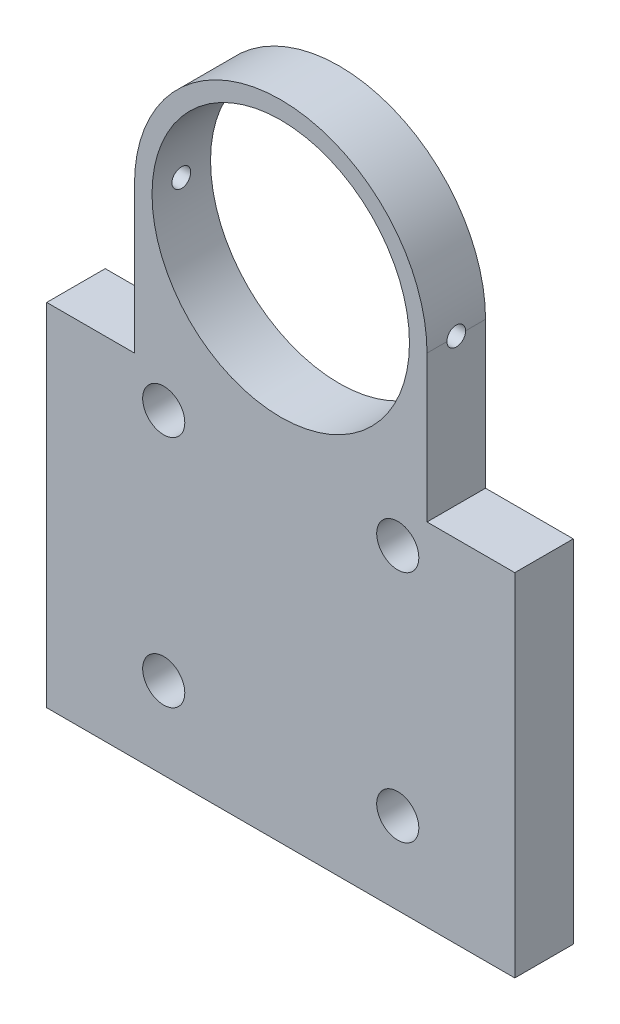
ISO-10303-21;
HEADER;
FILE_DESCRIPTION(('STEP AP214'),'2;1');
FILE_NAME('part.step','',(''),(''),'','','');
FILE_SCHEMA(('AUTOMOTIVE_DESIGN { 1 0 10303 214 1 1 1 1 }'));
ENDSEC;
DATA;
#1=APPLICATION_CONTEXT('core data for automotive mechanical design processes');
#2=APPLICATION_PROTOCOL_DEFINITION('international standard','automotive_design',2000,#1);
#3=PRODUCT_CONTEXT('',#1,'mechanical');
#4=PRODUCT('Part','Part','',(#3));
#5=PRODUCT_RELATED_PRODUCT_CATEGORY('part','',(#4));
#6=PRODUCT_DEFINITION_FORMATION('','',#4);
#7=PRODUCT_DEFINITION_CONTEXT('part definition',#1,'design');
#8=PRODUCT_DEFINITION('design','',#6,#7);
#9=PRODUCT_DEFINITION_SHAPE('','',#8);
#10=(LENGTH_UNIT() NAMED_UNIT(*) SI_UNIT(.MILLI.,.METRE.));
#11=(NAMED_UNIT(*) PLANE_ANGLE_UNIT() SI_UNIT($,.RADIAN.));
#12=(NAMED_UNIT(*) SI_UNIT($,.STERADIAN.) SOLID_ANGLE_UNIT());
#13=UNCERTAINTY_MEASURE_WITH_UNIT(LENGTH_MEASURE(1.E-05),#10,'distance_accuracy_value','');
#14=(GEOMETRIC_REPRESENTATION_CONTEXT(3) GLOBAL_UNCERTAINTY_ASSIGNED_CONTEXT((#13)) GLOBAL_UNIT_ASSIGNED_CONTEXT((#10,
#11,#12)) REPRESENTATION_CONTEXT('',''));
#15=CARTESIAN_POINT('',(0.,0.,0.));
#16=DIRECTION('',(0.,0.,1.));
#17=DIRECTION('',(1.,0.,0.));
#18=AXIS2_PLACEMENT_3D('',#15,#16,#17);
#19=CARTESIAN_POINT('',(-21.,10.5789473684211,5.));
#20=DIRECTION('',(0.,-1.,0.));
#21=DIRECTION('',(0.,0.,-1.));
#22=AXIS2_PLACEMENT_3D('',#19,#20,#21);
#23=PLANE('',#22);
#24=DIRECTION('',(0.,0.,1.));
#25=VECTOR('',#24,1.);
#26=CARTESIAN_POINT('',(-13.5,10.5789473684211,0.));
#27=LINE('',#26,#25);
#28=CARTESIAN_POINT('',(-13.5,10.5789473684211,0.));
#29=VERTEX_POINT('',#28);
#30=CARTESIAN_POINT('',(-13.5,10.5789473684211,5.));
#31=VERTEX_POINT('',#30);
#32=EDGE_CURVE('E139',#29,#31,#27,.T.);
#33=ORIENTED_EDGE('',*,*,#32,.F.);
#34=DIRECTION('',(-1.,0.,0.));
#35=VECTOR('',#34,1.);
#36=CARTESIAN_POINT('',(-21.,10.5789473684211,0.));
#37=LINE('',#36,#35);
#38=CARTESIAN_POINT('',(-21.,10.5789473684211,0.));
#39=VERTEX_POINT('',#38);
#40=EDGE_CURVE('E169',#29,#39,#37,.T.);
#41=ORIENTED_EDGE('',*,*,#40,.T.);
#42=DIRECTION('',(0.,0.,-1.));
#43=VECTOR('',#42,1.);
#44=CARTESIAN_POINT('',(-21.,10.5789473684211,5.));
#45=LINE('',#44,#43);
#46=CARTESIAN_POINT('',(-21.,10.5789473684211,5.));
#47=VERTEX_POINT('',#46);
#48=EDGE_CURVE('E162',#47,#39,#45,.T.);
#49=ORIENTED_EDGE('',*,*,#48,.F.);
#50=DIRECTION('',(-1.,0.,0.));
#51=VECTOR('',#50,1.);
#52=CARTESIAN_POINT('',(-21.,10.5789473684211,5.));
#53=LINE('',#52,#51);
#54=EDGE_CURVE('E158',#31,#47,#53,.T.);
#55=ORIENTED_EDGE('',*,*,#54,.F.);
#56=EDGE_LOOP('',(#33,#41,#49,#55));
#57=FACE_BOUND('',#56,.T.);
#58=ADVANCED_FACE('F39',(#57),#23,.F.);
#59=CARTESIAN_POINT('',(-21.,10.5789473684211,5.));
#60=DIRECTION('',(1.,0.,0.));
#61=DIRECTION('',(0.,0.,-1.));
#62=AXIS2_PLACEMENT_3D('',#59,#60,#61);
#63=PLANE('',#62);
#64=DIRECTION('',(0.,-1.,0.));
#65=VECTOR('',#64,1.);
#66=CARTESIAN_POINT('',(-21.,10.5789473684211,0.));
#67=LINE('',#66,#65);
#68=CARTESIAN_POINT('',(-21.,-19.4210526315789,0.));
#69=VERTEX_POINT('',#68);
#70=EDGE_CURVE('E137',#39,#69,#67,.T.);
#71=ORIENTED_EDGE('',*,*,#70,.T.);
#72=DIRECTION('',(0.,0.,-1.));
#73=VECTOR('',#72,1.);
#74=CARTESIAN_POINT('',(-21.,-19.4210526315789,5.));
#75=LINE('',#74,#73);
#76=CARTESIAN_POINT('',(-21.,-19.4210526315789,5.));
#77=VERTEX_POINT('',#76);
#78=EDGE_CURVE('E123',#77,#69,#75,.T.);
#79=ORIENTED_EDGE('',*,*,#78,.F.);
#80=DIRECTION('',(0.,-1.,0.));
#81=VECTOR('',#80,1.);
#82=CARTESIAN_POINT('',(-21.,10.5789473684211,5.));
#83=LINE('',#82,#81);
#84=EDGE_CURVE('E150',#47,#77,#83,.T.);
#85=ORIENTED_EDGE('',*,*,#84,.F.);
#86=ORIENTED_EDGE('',*,*,#48,.T.);
#87=EDGE_LOOP('',(#71,#79,#85,#86));
#88=FACE_BOUND('',#87,.T.);
#89=ADVANCED_FACE('F41',(#88),#63,.F.);
#90=CARTESIAN_POINT('',(-21.,-19.4210526315789,5.));
#91=DIRECTION('',(0.,1.,0.));
#92=DIRECTION('',(0.,0.,1.));
#93=AXIS2_PLACEMENT_3D('',#90,#91,#92);
#94=PLANE('',#93);
#95=DIRECTION('',(1.,0.,0.));
#96=VECTOR('',#95,1.);
#97=CARTESIAN_POINT('',(-21.,-19.4210526315789,0.));
#98=LINE('',#97,#96);
#99=CARTESIAN_POINT('',(19.,-19.4210526315789,0.));
#100=VERTEX_POINT('',#99);
#101=EDGE_CURVE('E165',#69,#100,#98,.T.);
#102=ORIENTED_EDGE('',*,*,#101,.T.);
#103=DIRECTION('',(0.,0.,-1.));
#104=VECTOR('',#103,1.);
#105=CARTESIAN_POINT('',(19.,-19.4210526315789,5.));
#106=LINE('',#105,#104);
#107=CARTESIAN_POINT('',(19.,-19.4210526315789,5.));
#108=VERTEX_POINT('',#107);
#109=EDGE_CURVE('E177',#108,#100,#106,.T.);
#110=ORIENTED_EDGE('',*,*,#109,.F.);
#111=DIRECTION('',(1.,0.,0.));
#112=VECTOR('',#111,1.);
#113=CARTESIAN_POINT('',(-21.,-19.4210526315789,5.));
#114=LINE('',#113,#112);
#115=EDGE_CURVE('E153',#77,#108,#114,.T.);
#116=ORIENTED_EDGE('',*,*,#115,.F.);
#117=ORIENTED_EDGE('',*,*,#78,.T.);
#118=EDGE_LOOP('',(#102,#110,#116,#117));
#119=FACE_BOUND('',#118,.T.);
#120=ADVANCED_FACE('F233',(#119),#94,.F.);
#121=CARTESIAN_POINT('',(19.,10.5789473684211,5.));
#122=DIRECTION('',(-1.,0.,0.));
#123=DIRECTION('',(0.,0.,1.));
#124=AXIS2_PLACEMENT_3D('',#121,#122,#123);
#125=PLANE('',#124);
#126=DIRECTION('',(0.,1.,0.));
#127=VECTOR('',#126,1.);
#128=CARTESIAN_POINT('',(19.,10.5789473684211,0.));
#129=LINE('',#128,#127);
#130=CARTESIAN_POINT('',(19.,10.5789473684211,0.));
#131=VERTEX_POINT('',#130);
#132=EDGE_CURVE('E167',#100,#131,#129,.T.);
#133=ORIENTED_EDGE('',*,*,#132,.T.);
#134=DIRECTION('',(0.,0.,-1.));
#135=VECTOR('',#134,1.);
#136=CARTESIAN_POINT('',(19.,10.5789473684211,5.));
#137=LINE('',#136,#135);
#138=CARTESIAN_POINT('',(19.,10.5789473684211,5.));
#139=VERTEX_POINT('',#138);
#140=EDGE_CURVE('E174',#139,#131,#137,.T.);
#141=ORIENTED_EDGE('',*,*,#140,.F.);
#142=DIRECTION('',(0.,1.,0.));
#143=VECTOR('',#142,1.);
#144=CARTESIAN_POINT('',(19.,10.5789473684211,5.));
#145=LINE('',#144,#143);
#146=EDGE_CURVE('E156',#108,#139,#145,.T.);
#147=ORIENTED_EDGE('',*,*,#146,.F.);
#148=ORIENTED_EDGE('',*,*,#109,.T.);
#149=EDGE_LOOP('',(#133,#141,#147,#148));
#150=FACE_BOUND('',#149,.T.);
#151=ADVANCED_FACE('F240',(#150),#125,.F.);
#152=CARTESIAN_POINT('',(11.5,10.5789473684211,0.));
#153=VERTEX_POINT('',#152);
#154=EDGE_CURVE('E154',#131,#153,#37,.T.);
#155=ORIENTED_EDGE('',*,*,#154,.T.);
#156=DIRECTION('',(0.,0.,1.));
#157=VECTOR('',#156,1.);
#158=CARTESIAN_POINT('',(11.5,10.5789473684211,0.));
#159=LINE('',#158,#157);
#160=CARTESIAN_POINT('',(11.5,10.5789473684211,5.));
#161=VERTEX_POINT('',#160);
#162=EDGE_CURVE('E135',#153,#161,#159,.T.);
#163=ORIENTED_EDGE('',*,*,#162,.T.);
#164=EDGE_CURVE('E159',#139,#161,#53,.T.);
#165=ORIENTED_EDGE('',*,*,#164,.F.);
#166=ORIENTED_EDGE('',*,*,#140,.T.);
#167=EDGE_LOOP('',(#155,#163,#165,#166));
#168=FACE_BOUND('',#167,.T.);
#169=ADVANCED_FACE('F229',(#168),#23,.F.);
#170=CARTESIAN_POINT('',(0.,0.,5.));
#171=DIRECTION('',(0.,0.,1.));
#172=DIRECTION('',(1.,0.,0.));
#173=AXIS2_PLACEMENT_3D('',#170,#171,#172);
#174=PLANE('',#173);
#175=CARTESIAN_POINT('',(-11.,7.57894736842105,5.));
#176=DIRECTION('',(0.,0.,1.));
#177=DIRECTION('',(1.,0.,0.));
#178=AXIS2_PLACEMENT_3D('',#175,#176,#177);
#179=CIRCLE('',#178,1.79999999999999);
#180=CARTESIAN_POINT('',(-9.20000000000001,7.57894736842105,5.));
#181=VERTEX_POINT('',#180);
#182=EDGE_CURVE('E298',#181,#181,#179,.T.);
#183=ORIENTED_EDGE('',*,*,#182,.F.);
#184=EDGE_LOOP('',(#183));
#185=FACE_BOUND('',#184,.T.);
#186=CARTESIAN_POINT('',(-11.,-12.4210526315789,5.));
#187=DIRECTION('',(0.,0.,1.));
#188=DIRECTION('',(1.,0.,0.));
#189=AXIS2_PLACEMENT_3D('',#186,#187,#188);
#190=CIRCLE('',#189,1.79999999999999);
#191=CARTESIAN_POINT('',(-9.20000000000001,-12.4210526315789,5.));
#192=VERTEX_POINT('',#191);
#193=EDGE_CURVE('E293',#192,#192,#190,.T.);
#194=ORIENTED_EDGE('',*,*,#193,.F.);
#195=EDGE_LOOP('',(#194));
#196=FACE_BOUND('',#195,.T.);
#197=CARTESIAN_POINT('',(9.00000000000001,-12.4210526315789,5.));
#198=DIRECTION('',(0.,0.,1.));
#199=DIRECTION('',(1.,0.,0.));
#200=AXIS2_PLACEMENT_3D('',#197,#198,#199);
#201=CIRCLE('',#200,1.79999999999999);
#202=CARTESIAN_POINT('',(10.8,-12.4210526315789,5.));
#203=VERTEX_POINT('',#202);
#204=EDGE_CURVE('E287',#203,#203,#201,.T.);
#205=ORIENTED_EDGE('',*,*,#204,.F.);
#206=EDGE_LOOP('',(#205));
#207=FACE_BOUND('',#206,.T.);
#208=CARTESIAN_POINT('',(9.00000000000001,7.57894736842105,5.));
#209=DIRECTION('',(0.,0.,1.));
#210=DIRECTION('',(1.,0.,0.));
#211=AXIS2_PLACEMENT_3D('',#208,#209,#210);
#212=CIRCLE('',#211,1.79999999999999);
#213=CARTESIAN_POINT('',(10.8,7.57894736842105,5.));
#214=VERTEX_POINT('',#213);
#215=EDGE_CURVE('E281',#214,#214,#212,.T.);
#216=ORIENTED_EDGE('',*,*,#215,.F.);
#217=EDGE_LOOP('',(#216));
#218=FACE_BOUND('',#217,.T.);
#219=CARTESIAN_POINT('',(-0.999999999999998,23.078947368421,5.));
#220=DIRECTION('',(0.,0.,1.));
#221=DIRECTION('',(1.,0.,0.));
#222=AXIS2_PLACEMENT_3D('',#219,#220,#221);
#223=CIRCLE('',#222,11.);
#224=CARTESIAN_POINT('',(10.,23.078947368421,5.));
#225=VERTEX_POINT('',#224);
#226=EDGE_CURVE('E275',#225,#225,#223,.T.);
#227=ORIENTED_EDGE('',*,*,#226,.F.);
#228=EDGE_LOOP('',(#227));
#229=FACE_BOUND('',#228,.T.);
#230=ORIENTED_EDGE('',*,*,#84,.T.);
#231=ORIENTED_EDGE('',*,*,#115,.T.);
#232=ORIENTED_EDGE('',*,*,#146,.T.);
#233=ORIENTED_EDGE('',*,*,#164,.T.);
#234=DIRECTION('',(0.,-1.,0.));
#235=VECTOR('',#234,1.);
#236=CARTESIAN_POINT('',(11.5,0.,5.));
#237=LINE('',#236,#235);
#238=CARTESIAN_POINT('',(11.5,23.0789473684211,5.));
#239=VERTEX_POINT('',#238);
#240=EDGE_CURVE('E142',#239,#161,#237,.T.);
#241=ORIENTED_EDGE('',*,*,#240,.F.);
#242=CARTESIAN_POINT('',(-0.999999999999997,23.0789473684211,5.));
#243=DIRECTION('',(0.,0.,1.));
#244=DIRECTION('',(1.,0.,0.));
#245=AXIS2_PLACEMENT_3D('',#242,#243,#244);
#246=CIRCLE('',#245,12.5);
#247=CARTESIAN_POINT('',(-13.5,23.0789473684211,5.));
#248=VERTEX_POINT('',#247);
#249=EDGE_CURVE('E134',#239,#248,#246,.T.);
#250=ORIENTED_EDGE('',*,*,#249,.T.);
#251=DIRECTION('',(0.,-1.,0.));
#252=VECTOR('',#251,1.);
#253=CARTESIAN_POINT('',(-13.5,0.,5.));
#254=LINE('',#253,#252);
#255=EDGE_CURVE('E264',#248,#31,#254,.T.);
#256=ORIENTED_EDGE('',*,*,#255,.T.);
#257=ORIENTED_EDGE('',*,*,#54,.T.);
#258=EDGE_LOOP('',(#230,#231,#232,#233,#241,#250,#256,#257));
#259=FACE_BOUND('',#258,.T.);
#260=ADVANCED_FACE('F239',(#185,#196,#207,#218,#229,#259),#174,.T.);
#261=CARTESIAN_POINT('',(0.,0.,0.));
#262=DIRECTION('',(0.,0.,1.));
#263=DIRECTION('',(1.,0.,0.));
#264=AXIS2_PLACEMENT_3D('',#261,#262,#263);
#265=PLANE('',#264);
#266=CARTESIAN_POINT('',(-11.,7.57894736842105,0.));
#267=DIRECTION('',(0.,0.,1.));
#268=DIRECTION('',(1.,0.,0.));
#269=AXIS2_PLACEMENT_3D('',#266,#267,#268);
#270=CIRCLE('',#269,1.8);
#271=CARTESIAN_POINT('',(-9.2,7.57894736842105,0.));
#272=VERTEX_POINT('',#271);
#273=EDGE_CURVE('E296',#272,#272,#270,.T.);
#274=ORIENTED_EDGE('',*,*,#273,.T.);
#275=EDGE_LOOP('',(#274));
#276=FACE_BOUND('',#275,.T.);
#277=CARTESIAN_POINT('',(-11.,-12.4210526315789,0.));
#278=DIRECTION('',(0.,0.,1.));
#279=DIRECTION('',(1.,0.,0.));
#280=AXIS2_PLACEMENT_3D('',#277,#278,#279);
#281=CIRCLE('',#280,1.8);
#282=CARTESIAN_POINT('',(-9.19999999999999,-12.4210526315789,0.));
#283=VERTEX_POINT('',#282);
#284=EDGE_CURVE('E290',#283,#283,#281,.T.);
#285=ORIENTED_EDGE('',*,*,#284,.T.);
#286=EDGE_LOOP('',(#285));
#287=FACE_BOUND('',#286,.T.);
#288=CARTESIAN_POINT('',(9.00000000000001,-12.4210526315789,0.));
#289=DIRECTION('',(0.,0.,1.));
#290=DIRECTION('',(1.,0.,0.));
#291=AXIS2_PLACEMENT_3D('',#288,#289,#290);
#292=CIRCLE('',#291,1.8);
#293=CARTESIAN_POINT('',(10.8,-12.4210526315789,0.));
#294=VERTEX_POINT('',#293);
#295=EDGE_CURVE('E284',#294,#294,#292,.T.);
#296=ORIENTED_EDGE('',*,*,#295,.T.);
#297=EDGE_LOOP('',(#296));
#298=FACE_BOUND('',#297,.T.);
#299=CARTESIAN_POINT('',(9.00000000000001,7.57894736842105,0.));
#300=DIRECTION('',(0.,0.,1.));
#301=DIRECTION('',(1.,0.,0.));
#302=AXIS2_PLACEMENT_3D('',#299,#300,#301);
#303=CIRCLE('',#302,1.8);
#304=CARTESIAN_POINT('',(10.8,7.57894736842105,0.));
#305=VERTEX_POINT('',#304);
#306=EDGE_CURVE('E278',#305,#305,#303,.T.);
#307=ORIENTED_EDGE('',*,*,#306,.T.);
#308=EDGE_LOOP('',(#307));
#309=FACE_BOUND('',#308,.T.);
#310=CARTESIAN_POINT('',(-0.999999999999998,23.078947368421,0.));
#311=DIRECTION('',(0.,0.,1.));
#312=DIRECTION('',(1.,0.,0.));
#313=AXIS2_PLACEMENT_3D('',#310,#311,#312);
#314=CIRCLE('',#313,11.);
#315=CARTESIAN_POINT('',(10.,23.078947368421,0.));
#316=VERTEX_POINT('',#315);
#317=EDGE_CURVE('E269',#316,#316,#314,.T.);
#318=ORIENTED_EDGE('',*,*,#317,.T.);
#319=EDGE_LOOP('',(#318));
#320=FACE_BOUND('',#319,.T.);
#321=ORIENTED_EDGE('',*,*,#70,.F.);
#322=ORIENTED_EDGE('',*,*,#40,.F.);
#323=DIRECTION('',(0.,-1.,0.));
#324=VECTOR('',#323,1.);
#325=CARTESIAN_POINT('',(-13.5,0.,0.));
#326=LINE('',#325,#324);
#327=CARTESIAN_POINT('',(-13.5,23.0789473684211,0.));
#328=VERTEX_POINT('',#327);
#329=EDGE_CURVE('E261',#328,#29,#326,.T.);
#330=ORIENTED_EDGE('',*,*,#329,.F.);
#331=CARTESIAN_POINT('',(-0.999999999999997,23.0789473684211,0.));
#332=DIRECTION('',(0.,0.,1.));
#333=DIRECTION('',(1.,0.,0.));
#334=AXIS2_PLACEMENT_3D('',#331,#332,#333);
#335=CIRCLE('',#334,12.5);
#336=CARTESIAN_POINT('',(11.5,23.0789473684211,0.));
#337=VERTEX_POINT('',#336);
#338=EDGE_CURVE('E260',#337,#328,#335,.T.);
#339=ORIENTED_EDGE('',*,*,#338,.F.);
#340=DIRECTION('',(0.,-1.,0.));
#341=VECTOR('',#340,1.);
#342=CARTESIAN_POINT('',(11.5,0.,0.));
#343=LINE('',#342,#341);
#344=EDGE_CURVE('E257',#337,#153,#343,.T.);
#345=ORIENTED_EDGE('',*,*,#344,.T.);
#346=ORIENTED_EDGE('',*,*,#154,.F.);
#347=ORIENTED_EDGE('',*,*,#132,.F.);
#348=ORIENTED_EDGE('',*,*,#101,.F.);
#349=EDGE_LOOP('',(#321,#322,#330,#339,#345,#346,#347,#348));
#350=FACE_BOUND('',#349,.T.);
#351=ADVANCED_FACE('F246',(#276,#287,#298,#309,#320,#350),#265,.F.);
#352=CARTESIAN_POINT('',(-0.999999999999997,23.0789473684211,0.));
#353=DIRECTION('',(0.,0.,1.));
#354=DIRECTION('',(1.,0.,0.));
#355=AXIS2_PLACEMENT_3D('',#352,#353,#354);
#356=CYLINDRICAL_SURFACE('',#355,12.5);
#357=CARTESIAN_POINT('',(-13.5,23.0789473684211,3.3));
#358=CARTESIAN_POINT('',(-13.500009324827,23.1239043571365,3.30003843768824));
#359=CARTESIAN_POINT('',(-13.4997577278578,23.1688488998711,3.29621270249248));
#360=CARTESIAN_POINT('',(-13.4988016404107,23.2574291850839,3.28111744909941));
#361=CARTESIAN_POINT('',(-13.4980975200611,23.3010659667056,3.2698540141439));
#362=CARTESIAN_POINT('',(-13.496304742774,23.3858425126583,3.24016070909847));
#363=CARTESIAN_POINT('',(-13.4952159211092,23.4269811984598,3.22172776871925));
#364=CARTESIAN_POINT('',(-13.4927792066958,23.5055744344902,3.17823669385076));
#365=CARTESIAN_POINT('',(-13.4914313568159,23.5430295927888,3.15317965538219));
#366=CARTESIAN_POINT('',(-13.4886250932701,23.6132537266337,3.09710840832484));
#367=CARTESIAN_POINT('',(-13.4871665389431,23.6460165823085,3.06608654144862));
#368=CARTESIAN_POINT('',(-13.4843044662695,23.7058780861235,2.99897879147311));
#369=CARTESIAN_POINT('',(-13.4829009563378,23.7329758709448,2.96289213793264));
#370=CARTESIAN_POINT('',(-13.4803062495662,23.7807529262762,2.88664538451462));
#371=CARTESIAN_POINT('',(-13.4791152282162,23.8014269018489,2.84648196026909));
#372=CARTESIAN_POINT('',(-13.4770818030592,23.8357344571371,2.76324770165291));
#373=CARTESIAN_POINT('',(-13.4762393740012,23.8493685468196,2.72017707813449));
#374=CARTESIAN_POINT('',(-13.4749994409246,23.8691932262025,2.63241107532125));
#375=CARTESIAN_POINT('',(-13.474601331411,23.8753939465578,2.58771799305229));
#376=CARTESIAN_POINT('',(-13.4742931193321,23.8802071741541,2.4979225986159));
#377=CARTESIAN_POINT('',(-13.4743830230442,23.878819583784,2.4528202811918));
#378=CARTESIAN_POINT('',(-13.4750401533969,23.8685037185327,2.36355826152029));
#379=CARTESIAN_POINT('',(-13.4756066717579,23.8595866328871,2.31939726020862));
#380=CARTESIAN_POINT('',(-13.4771520712815,23.834482284883,2.23320036401512));
#381=CARTESIAN_POINT('',(-13.478130953138,23.8182950102903,2.19116447270957));
#382=CARTESIAN_POINT('',(-13.4803916068206,23.7790967294459,2.11037408963184));
#383=CARTESIAN_POINT('',(-13.4816736099266,23.7560805093099,2.07162213430687));
#384=CARTESIAN_POINT('',(-13.4843957265884,23.7038825389632,1.99852943053225));
#385=CARTESIAN_POINT('',(-13.4858358345621,23.6747010063927,1.96418852643795));
#386=CARTESIAN_POINT('',(-13.4887148648609,23.6109425311004,1.90083013064313));
#387=CARTESIAN_POINT('',(-13.4901537812141,23.5763566810207,1.87182160265181));
#388=CARTESIAN_POINT('',(-13.4928664408433,23.502787523973,1.82001196403028));
#389=CARTESIAN_POINT('',(-13.4941401324877,23.4638028494823,1.79721279134864));
#390=CARTESIAN_POINT('',(-13.4963790682752,23.3825322094063,1.75847078699582));
#391=CARTESIAN_POINT('',(-13.4973441096396,23.3402440961135,1.74253246043153));
#392=CARTESIAN_POINT('',(-13.498854269046,23.2536169684637,1.71800874615765));
#393=CARTESIAN_POINT('',(-13.4994000256223,23.2092811821448,1.70941217535491));
#394=CARTESIAN_POINT('',(-13.4998042187066,23.1503614976764,1.70306446491594));
#395=CARTESIAN_POINT('',(-13.4998775964454,23.1360903765343,1.70191469729486));
#396=CARTESIAN_POINT('',(-13.4999754235184,23.1075305761044,1.70038350994425));
#397=CARTESIAN_POINT('',(-13.4999999539809,23.0932419654346,1.70000081620679));
#398=CARTESIAN_POINT('',(-13.5,23.0789473684211,1.7));
#399=B_SPLINE_CURVE_WITH_KNOTS('',3,(#357,#358,#359,#360,#361,#362,#363,#364,#365,#366,#367,
#368,#369,#370,#371,#372,#373,#374,#375,#376,#377,#378,#379,#380,#381,#382,#383,#384,#385,#386,
#387,#388,#389,#390,#391,#392,#393,#394,#395,#396,#397,#398),.UNSPECIFIED.,.F.,.F.,(4,2,2,2,2,2,
2,2,2,2,2,2,2,2,2,2,2,2,2,2,4),(0.,0.13468976313037,0.269269500679859,0.403906934605164,
0.53852210540087,0.673311277824672,0.808120976267469,0.943041500985903,1.07795225073311,
1.21267892598129,1.34740733426862,1.48193588052909,1.61646465317549,1.75109640370693,
1.88572340242989,2.02057467955862,2.15546799585623,2.29044975389995,2.42522553673565,
2.46816359043064,2.51103027042707),.UNSPECIFIED.);
#400=CARTESIAN_POINT('',(-13.5,23.0789473684211,3.3));
#401=VERTEX_POINT('',#400);
#402=CARTESIAN_POINT('',(-13.5,23.0789473684211,1.7));
#403=VERTEX_POINT('',#402);
#404=EDGE_CURVE('E11',#401,#403,#399,.T.);
#405=ORIENTED_EDGE('',*,*,#404,.F.);
#406=DIRECTION('',(0.,0.,1.));
#407=VECTOR('',#406,1.);
#408=CARTESIAN_POINT('',(-13.5,23.0789473684211,0.));
#409=LINE('',#408,#407);
#410=EDGE_CURVE('E149',#401,#248,#409,.T.);
#411=ORIENTED_EDGE('',*,*,#410,.T.);
#412=ORIENTED_EDGE('',*,*,#249,.F.);
#413=DIRECTION('',(0.,0.,1.));
#414=VECTOR('',#413,1.);
#415=CARTESIAN_POINT('',(11.5,23.0789473684211,0.));
#416=LINE('',#415,#414);
#417=CARTESIAN_POINT('',(11.5,23.0789473684211,3.3));
#418=VERTEX_POINT('',#417);
#419=EDGE_CURVE('E126',#418,#239,#416,.T.);
#420=ORIENTED_EDGE('',*,*,#419,.F.);
#421=CARTESIAN_POINT('',(11.5,23.0789473684211,1.7));
#422=CARTESIAN_POINT('',(11.500009324827,23.1239043571365,1.69996156231176));
#423=CARTESIAN_POINT('',(11.4997577278578,23.1688488998711,1.70378729750752));
#424=CARTESIAN_POINT('',(11.4988016404107,23.2574291850839,1.71888255090059));
#425=CARTESIAN_POINT('',(11.4980975200612,23.3010659667056,1.7301459858561));
#426=CARTESIAN_POINT('',(11.496304742774,23.3858425126583,1.75983929090153));
#427=CARTESIAN_POINT('',(11.4952159211092,23.4269811984598,1.77827223128075));
#428=CARTESIAN_POINT('',(11.4927792066958,23.5055744344902,1.82176330614924));
#429=CARTESIAN_POINT('',(11.4914313568159,23.5430295927888,1.84682034461781));
#430=CARTESIAN_POINT('',(11.4886250932701,23.6132537266337,1.90289159167516));
#431=CARTESIAN_POINT('',(11.4871665389431,23.6460165823085,1.93391345855138));
#432=CARTESIAN_POINT('',(11.4843044662695,23.7058780861235,2.00102120852689));
#433=CARTESIAN_POINT('',(11.4829009563378,23.7329758709448,2.03710786206736));
#434=CARTESIAN_POINT('',(11.4803062495662,23.7807529262762,2.11335461548538));
#435=CARTESIAN_POINT('',(11.4791152282162,23.8014269018489,2.15351803973091));
#436=CARTESIAN_POINT('',(11.4770818030592,23.8357344571371,2.23675229834709));
#437=CARTESIAN_POINT('',(11.4762393740012,23.8493685468196,2.27982292186551));
#438=CARTESIAN_POINT('',(11.4749994409246,23.8691932262025,2.36758892467875));
#439=CARTESIAN_POINT('',(11.474601331411,23.8753939465578,2.41228200694771));
#440=CARTESIAN_POINT('',(11.4742931193321,23.8802071741541,2.5020774013841));
#441=CARTESIAN_POINT('',(11.4743830230442,23.878819583784,2.5471797188082));
#442=CARTESIAN_POINT('',(11.4750401533969,23.8685037185327,2.63644173847971));
#443=CARTESIAN_POINT('',(11.4756066717579,23.8595866328871,2.68060273979138));
#444=CARTESIAN_POINT('',(11.4771520712815,23.834482284883,2.76679963598488));
#445=CARTESIAN_POINT('',(11.478130953138,23.8182950102903,2.80883552729043));
#446=CARTESIAN_POINT('',(11.4803916068206,23.7790967294459,2.88962591036816));
#447=CARTESIAN_POINT('',(11.4816736099266,23.7560805093099,2.92837786569313));
#448=CARTESIAN_POINT('',(11.4843957265884,23.7038825389632,3.00147056946775));
#449=CARTESIAN_POINT('',(11.4858358345621,23.6747010063927,3.03581147356205));
#450=CARTESIAN_POINT('',(11.4887148648609,23.6109425311004,3.09916986935687));
#451=CARTESIAN_POINT('',(11.4901537812141,23.5763566810207,3.1281783973482));
#452=CARTESIAN_POINT('',(11.4928664408433,23.502787523973,3.17998803596972));
#453=CARTESIAN_POINT('',(11.4941401324877,23.4638028494823,3.20278720865136));
#454=CARTESIAN_POINT('',(11.4963790682752,23.3825322094063,3.24152921300418));
#455=CARTESIAN_POINT('',(11.4973441096396,23.3402440961135,3.25746753956847));
#456=CARTESIAN_POINT('',(11.498854269046,23.2536169684637,3.28199125384235));
#457=CARTESIAN_POINT('',(11.4994000256223,23.2092811821448,3.29058782464509));
#458=CARTESIAN_POINT('',(11.4998042187066,23.1503614976764,3.29693553508406));
#459=CARTESIAN_POINT('',(11.4998775964454,23.1360903765343,3.29808530270514));
#460=CARTESIAN_POINT('',(11.4999754235184,23.1075305761044,3.29961649005575));
#461=CARTESIAN_POINT('',(11.4999999539809,23.0932419654346,3.29999918379321));
#462=CARTESIAN_POINT('',(11.5,23.0789473684211,3.3));
#463=B_SPLINE_CURVE_WITH_KNOTS('',3,(#421,#422,#423,#424,#425,#426,#427,#428,#429,#430,#431,
#432,#433,#434,#435,#436,#437,#438,#439,#440,#441,#442,#443,#444,#445,#446,#447,#448,#449,#450,
#451,#452,#453,#454,#455,#456,#457,#458,#459,#460,#461,#462),.UNSPECIFIED.,.F.,.F.,(4,2,2,2,2,2,
2,2,2,2,2,2,2,2,2,2,2,2,2,2,4),(0.,0.13468976313037,0.269269500679859,0.40390693460516,
0.53852210540087,0.673311277824672,0.808120976267469,0.943041500985903,1.07795225073311,
1.21267892598129,1.34740733426862,1.48193588052909,1.61646465317549,1.75109640370693,
1.88572340242989,2.02057467955862,2.15546799585623,2.29044975389995,2.42522553673565,
2.46816359043064,2.51103027042707),.UNSPECIFIED.);
#464=CARTESIAN_POINT('',(11.5,23.0789473684211,1.7));
#465=VERTEX_POINT('',#464);
#466=EDGE_CURVE('E53',#465,#418,#463,.T.);
#467=ORIENTED_EDGE('',*,*,#466,.F.);
#468=EDGE_CURVE('E129',#337,#465,#416,.T.);
#469=ORIENTED_EDGE('',*,*,#468,.F.);
#470=ORIENTED_EDGE('',*,*,#338,.T.);
#471=EDGE_CURVE('E146',#328,#403,#409,.T.);
#472=ORIENTED_EDGE('',*,*,#471,.T.);
#473=EDGE_LOOP('',(#405,#411,#412,#420,#467,#469,#470,#472));
#474=FACE_BOUND('',#473,.T.);
#475=ADVANCED_FACE('F132',(#474),#356,.T.);
#476=CARTESIAN_POINT('',(11.5,0.,0.));
#477=DIRECTION('',(-1.,0.,0.));
#478=DIRECTION('',(0.,0.,1.));
#479=AXIS2_PLACEMENT_3D('',#476,#477,#478);
#480=PLANE('',#479);
#481=ORIENTED_EDGE('',*,*,#468,.T.);
#482=CARTESIAN_POINT('',(11.5,23.0789473684211,2.5));
#483=DIRECTION('',(1.,0.,0.));
#484=DIRECTION('',(0.,0.,-1.));
#485=AXIS2_PLACEMENT_3D('',#482,#483,#484);
#486=CIRCLE('',#485,0.799999999999999);
#487=EDGE_CURVE('E65',#418,#465,#486,.T.);
#488=ORIENTED_EDGE('',*,*,#487,.F.);
#489=ORIENTED_EDGE('',*,*,#419,.T.);
#490=ORIENTED_EDGE('',*,*,#240,.T.);
#491=ORIENTED_EDGE('',*,*,#162,.F.);
#492=ORIENTED_EDGE('',*,*,#344,.F.);
#493=EDGE_LOOP('',(#481,#488,#489,#490,#491,#492));
#494=FACE_BOUND('',#493,.T.);
#495=ADVANCED_FACE('F125',(#494),#480,.F.);
#496=CARTESIAN_POINT('',(-13.5,0.,0.));
#497=DIRECTION('',(-1.,0.,0.));
#498=DIRECTION('',(0.,-1.,0.));
#499=AXIS2_PLACEMENT_3D('',#496,#497,#498);
#500=PLANE('',#499);
#501=CARTESIAN_POINT('',(-13.5,23.0789473684211,2.5));
#502=DIRECTION('',(-1.,0.,0.));
#503=DIRECTION('',(0.,-1.,0.));
#504=AXIS2_PLACEMENT_3D('',#501,#502,#503);
#505=CIRCLE('',#504,0.799999999999997);
#506=EDGE_CURVE('E58',#403,#401,#505,.T.);
#507=ORIENTED_EDGE('',*,*,#506,.F.);
#508=ORIENTED_EDGE('',*,*,#471,.F.);
#509=ORIENTED_EDGE('',*,*,#329,.T.);
#510=ORIENTED_EDGE('',*,*,#32,.T.);
#511=ORIENTED_EDGE('',*,*,#255,.F.);
#512=ORIENTED_EDGE('',*,*,#410,.F.);
#513=EDGE_LOOP('',(#507,#508,#509,#510,#511,#512));
#514=FACE_BOUND('',#513,.T.);
#515=ADVANCED_FACE('F217',(#514),#500,.T.);
#516=CARTESIAN_POINT('',(-0.999999999999998,23.078947368421,5.));
#517=DIRECTION('',(0.,0.,1.));
#518=DIRECTION('',(1.,0.,0.));
#519=AXIS2_PLACEMENT_3D('',#516,#517,#518);
#520=CYLINDRICAL_SURFACE('',#519,11.);
#521=CARTESIAN_POINT('',(10.,23.078947368421,1.7));
#522=CARTESIAN_POINT('',(9.99999961578059,23.1238200965865,1.70000196808036));
#523=CARTESIAN_POINT('',(9.99972249119568,23.1687238476507,1.70378812076572));
#524=CARTESIAN_POINT('',(9.99864362963137,23.2572903162799,1.71883685078239));
#525=CARTESIAN_POINT('',(9.99784128946093,23.3009515466213,1.73010802460453));
#526=CARTESIAN_POINT('',(9.9958027184029,23.3857373425803,1.75980034044489));
#527=CARTESIAN_POINT('',(9.99456672401778,23.4268632765306,1.77821758578082));
#528=CARTESIAN_POINT('',(9.99179967484401,23.5054296615314,1.82167262356602));
#529=CARTESIAN_POINT('',(9.99026868561492,23.5428709286729,1.84670894545314));
#530=CARTESIAN_POINT('',(9.98708021877861,23.6130895104151,1.90274522981627));
#531=CARTESIAN_POINT('',(9.98542252466931,23.6458585549237,1.93375554403776));
#532=CARTESIAN_POINT('',(9.98216931294526,23.7057316449672,2.00083789436049));
#533=CARTESIAN_POINT('',(9.98057379799044,23.7328354483664,2.03691014670185));
#534=CARTESIAN_POINT('',(9.97762314406713,23.7806355715987,2.11314106486694));
#535=CARTESIAN_POINT('',(9.97626827185953,23.8013247993537,2.15330418894494));
#536=CARTESIAN_POINT('',(9.9739545807479,23.8356631472801,2.23654560270492));
#537=CARTESIAN_POINT('',(9.97299575634361,23.8493123652228,2.27962385189242));
#538=CARTESIAN_POINT('',(9.97158440315888,23.869159707003,2.36739118135464));
#539=CARTESIAN_POINT('',(9.97113097402048,23.8753710827744,2.41207725017827));
#540=CARTESIAN_POINT('',(9.97077885228267,23.8802073455226,2.50185985386446));
#541=CARTESIAN_POINT('',(9.97088015152348,23.878832344091,2.54695638267962));
#542=CARTESIAN_POINT('',(9.97162522772197,23.8685458573666,2.63618925022909));
#543=CARTESIAN_POINT('',(9.97226797047848,23.8596487398097,2.68032725506953));
#544=CARTESIAN_POINT('',(9.97402188131556,23.8345928797207,2.76648171535796));
#545=CARTESIAN_POINT('',(9.97513305301094,23.818434081151,2.80849815443125));
#546=CARTESIAN_POINT('',(9.97769980115518,23.7792973386934,2.88926278468504));
#547=CARTESIAN_POINT('',(9.97915570486896,23.7563129097179,2.92800782251427));
#548=CARTESIAN_POINT('',(9.98224754482316,23.704182036789,3.00109534386899));
#549=CARTESIAN_POINT('',(9.98388348382675,23.6750354982539,3.03543775980605));
#550=CARTESIAN_POINT('',(9.98715564731158,23.6113270015975,3.09882875144365));
#551=CARTESIAN_POINT('',(9.98879186362033,23.5767526152589,3.12786483856819));
#552=CARTESIAN_POINT('',(9.99187656748351,23.5032133351186,3.17972251116011));
#553=CARTESIAN_POINT('',(9.99332505494817,23.4642484392171,3.20254409365527));
#554=CARTESIAN_POINT('',(9.99587127170476,23.3830263870073,3.24132400709627));
#555=CARTESIAN_POINT('',(9.99696897495688,23.3407689865755,3.25728182855405));
#556=CARTESIAN_POINT('',(9.99868961255283,23.2541649956394,3.28187271144715));
#557=CARTESIAN_POINT('',(9.99931255440117,23.20981843817,3.29050588866284));
#558=CARTESIAN_POINT('',(10.0000125131052,23.1204032746753,3.30018686098669));
#559=CARTESIAN_POINT('',(10.0000907720968,23.0753365465841,3.30125191513107));
#560=CARTESIAN_POINT('',(9.99969585718942,22.9856651260592,3.29581155702978));
#561=CARTESIAN_POINT('',(9.99922268719285,22.9410604303581,3.28930619835846));
#562=CARTESIAN_POINT('',(9.99777895554052,22.8536281263079,3.26892397491938));
#563=CARTESIAN_POINT('',(9.99680893072501,22.8107986537485,3.25505506570909));
#564=CARTESIAN_POINT('',(9.99448054525158,22.7280749329809,3.22034752874255));
#565=CARTESIAN_POINT('',(9.99312217988425,22.6881807203759,3.19950881646274));
#566=CARTESIAN_POINT('',(9.99016648174932,22.6123811571263,3.15140952851991));
#567=CARTESIAN_POINT('',(9.98856872350808,22.5764831109845,3.12413746824778));
#568=CARTESIAN_POINT('',(9.98531534490601,22.5097685186575,3.06396229641501));
#569=CARTESIAN_POINT('',(9.98365972377855,22.4789520398298,3.03105911022416));
#570=CARTESIAN_POINT('',(9.98047358139399,22.4232165468214,2.96048102648496));
#571=CARTESIAN_POINT('',(9.97894330184817,22.398308759557,2.92279725063409));
#572=CARTESIAN_POINT('',(9.97618431319909,22.3551745670147,2.84377211393974));
#573=CARTESIAN_POINT('',(9.97495560170676,22.3369481088059,2.80243078207549));
#574=CARTESIAN_POINT('',(9.97294007773472,22.3077132548956,2.71730449704779));
#575=CARTESIAN_POINT('',(9.9721528381708,22.2966978813881,2.67352195078821));
#576=CARTESIAN_POINT('',(9.97110786710332,22.2821751254548,2.58472284817629));
#577=CARTESIAN_POINT('',(9.97085012811716,22.2786676369317,2.53970630927116));
#578=CARTESIAN_POINT('',(9.97089341031709,22.2792613208972,2.44982866813512));
#579=CARTESIAN_POINT('',(9.97119313573321,22.2833448488194,2.40496744766816));
#580=CARTESIAN_POINT('',(9.97231482500005,22.2989679700968,2.31656959266768));
#581=CARTESIAN_POINT('',(9.97313678973616,22.3105075760927,2.27303296037997));
#582=CARTESIAN_POINT('',(9.97521000791328,22.3407110674241,2.18851820286693));
#583=CARTESIAN_POINT('',(9.97646124967211,22.3593747588889,2.14754000805312));
#584=CARTESIAN_POINT('',(9.9792520335999,22.4032944671085,2.06929604111151));
#585=CARTESIAN_POINT('',(9.98079156964635,22.4285503438697,2.03203019017051));
#586=CARTESIAN_POINT('',(9.98398968661292,22.4850034595205,1.96217875228358));
#587=CARTESIAN_POINT('',(9.98564852191926,22.5162136439939,1.92960363964761));
#588=CARTESIAN_POINT('',(9.98889604838436,22.5836683676934,1.87014260660637));
#589=CARTESIAN_POINT('',(9.99048472237143,22.6199141304548,1.84325807290563));
#590=CARTESIAN_POINT('',(9.99341511173317,22.6964652563315,1.795914266142));
#591=CARTESIAN_POINT('',(9.99475644862666,22.7367766974131,1.77546480695245));
#592=CARTESIAN_POINT('',(9.99703629815029,22.8202421787093,1.74165009708898));
#593=CARTESIAN_POINT('',(9.99797527834479,22.8633928518893,1.72827661940175));
#594=CARTESIAN_POINT('',(9.99910082676201,22.9354939837437,1.7124376347665));
#595=CARTESIAN_POINT('',(9.99943650163666,22.9639794147329,1.70777962894011));
#596=CARTESIAN_POINT('',(9.99988621149399,23.0212880833341,1.70156018219714));
#597=CARTESIAN_POINT('',(10.0000002469065,23.0501113202909,1.69999873527503));
#598=CARTESIAN_POINT('',(10.,23.078947368421,1.7));
#599=B_SPLINE_CURVE_WITH_KNOTS('',3,(#521,#522,#523,#524,#525,#526,#527,#528,#529,#530,#531,
#532,#533,#534,#535,#536,#537,#538,#539,#540,#541,#542,#543,#544,#545,#546,#547,#548,#549,#550,
#551,#552,#553,#554,#555,#556,#557,#558,#559,#560,#561,#562,#563,#564,#565,#566,#567,#568,#569,
#570,#571,#572,#573,#574,#575,#576,#577,#578,#579,#580,#581,#582,#583,#584,#585,#586,#587,#588,
#589,#590,#591,#592,#593,#594,#595,#596,#597,#598),.UNSPECIFIED.,.T.,.F.,(4,2,2,2,2,2,2,2,2,2,2,
2,2,2,2,2,2,2,2,2,2,2,2,2,2,2,2,2,2,2,2,2,2,2,2,2,2,2,4),(0.,0.134512909336568,
0.269180573538328,0.403774907757515,0.538339364206945,0.67313912635472,0.807944648746095,
0.94289868755806,1.07785085208519,1.21256221413557,1.34727159465527,1.4817242511996,
1.61617794531986,1.7507597959495,1.88534371241393,2.02024040705174,2.1551371662069,
2.29004393684586,2.42494857497899,2.55954546528126,2.69414140307283,2.82859221884939,
2.96304466518437,3.09773897281383,3.23243506570725,3.36738507635803,3.50233401788039,
3.63715218227879,3.77196844148858,3.90647172541059,4.0409752373663,4.17547508928536,
4.30997208515877,4.44476490119251,4.57959052639469,4.71462078326664,4.84949369793987,
4.93593435820371,5.02237485082236),.UNSPECIFIED.);
#600=CARTESIAN_POINT('',(10.,23.078947368421,1.7));
#601=VERTEX_POINT('',#600);
#602=EDGE_CURVE('E206',#601,#601,#599,.T.);
#603=ORIENTED_EDGE('',*,*,#602,.T.);
#604=EDGE_LOOP('',(#603));
#605=FACE_BOUND('',#604,.T.);
#606=CARTESIAN_POINT('',(-12.,23.0789473684211,1.7));
#607=CARTESIAN_POINT('',(-11.9999996157806,23.0340746402556,1.70000196808036));
#608=CARTESIAN_POINT('',(-11.9997224911957,22.9891708891914,1.70378812076572));
#609=CARTESIAN_POINT('',(-11.9986436296314,22.9006044205622,1.71883685078239));
#610=CARTESIAN_POINT('',(-11.9978412894609,22.8569431902208,1.73010802460453));
#611=CARTESIAN_POINT('',(-11.9958027184029,22.7721573942618,1.75980034044489));
#612=CARTESIAN_POINT('',(-11.9945667240178,22.7310314603115,1.77821758578082));
#613=CARTESIAN_POINT('',(-11.991799674844,22.6524650753107,1.82167262356602));
#614=CARTESIAN_POINT('',(-11.9902686856149,22.6150238081692,1.84670894545315));
#615=CARTESIAN_POINT('',(-11.9870802187786,22.544805226427,1.90274522981627));
#616=CARTESIAN_POINT('',(-11.9854225246693,22.5120361819184,1.93375554403777));
#617=CARTESIAN_POINT('',(-11.9821693129453,22.4521630918749,2.00083789436049));
#618=CARTESIAN_POINT('',(-11.9805737979904,22.4250592884757,2.03691014670186));
#619=CARTESIAN_POINT('',(-11.9776231440671,22.3772591652434,2.11314106486695));
#620=CARTESIAN_POINT('',(-11.9762682718595,22.3565699374884,2.15330418894494));
#621=CARTESIAN_POINT('',(-11.9739545807479,22.322231589562,2.23654560270493));
#622=CARTESIAN_POINT('',(-11.9729957563436,22.3085823716193,2.27962385189242));
#623=CARTESIAN_POINT('',(-11.9715844031589,22.2887350298391,2.36739118135465));
#624=CARTESIAN_POINT('',(-11.9711309740205,22.2825236540677,2.41207725017827));
#625=CARTESIAN_POINT('',(-11.9707788522827,22.2776873913195,2.50185985386446));
#626=CARTESIAN_POINT('',(-11.9708801515235,22.2790623927511,2.54695638267963));
#627=CARTESIAN_POINT('',(-11.971625227722,22.2893488794755,2.63618925022909));
#628=CARTESIAN_POINT('',(-11.9722679704785,22.2982459970324,2.68032725506953));
#629=CARTESIAN_POINT('',(-11.9740218813156,22.3233018571214,2.76648171535796));
#630=CARTESIAN_POINT('',(-11.9751330530109,22.3394606556911,2.80849815443125));
#631=CARTESIAN_POINT('',(-11.9776998011552,22.3785973981487,2.88926278468505));
#632=CARTESIAN_POINT('',(-11.979155704869,22.4015818271242,2.92800782251427));
#633=CARTESIAN_POINT('',(-11.9822475448232,22.4537127000531,3.001095343869));
#634=CARTESIAN_POINT('',(-11.9838834838267,22.4828592385882,3.03543775980605));
#635=CARTESIAN_POINT('',(-11.9871556473116,22.5465677352446,3.09882875144366));
#636=CARTESIAN_POINT('',(-11.9887918636203,22.5811421215832,3.12786483856819));
#637=CARTESIAN_POINT('',(-11.9918765674835,22.6546814017235,3.17972251116012));
#638=CARTESIAN_POINT('',(-11.9933250549482,22.693646297625,3.20254409365528));
#639=CARTESIAN_POINT('',(-11.9958712717048,22.7748683498348,3.24132400709627));
#640=CARTESIAN_POINT('',(-11.9969689749569,22.8171257502666,3.25728182855405));
#641=CARTESIAN_POINT('',(-11.9986896125528,22.9037297412027,3.28187271144715));
#642=CARTESIAN_POINT('',(-11.9993125544012,22.9480762986721,3.29050588866284));
#643=CARTESIAN_POINT('',(-12.0000125131052,23.0374914621668,3.30018686098669));
#644=CARTESIAN_POINT('',(-12.0000907720967,23.082558190258,3.30125191513107));
#645=CARTESIAN_POINT('',(-11.9996958571894,23.1722296107829,3.29581155702978));
#646=CARTESIAN_POINT('',(-11.9992226871928,23.216834306484,3.28930619835846));
#647=CARTESIAN_POINT('',(-11.9977789555405,23.3042666105342,3.26892397491938));
#648=CARTESIAN_POINT('',(-11.996808930725,23.3470960830936,3.25505506570909));
#649=CARTESIAN_POINT('',(-11.9944805452516,23.4298198038612,3.22034752874254));
#650=CARTESIAN_POINT('',(-11.9931221798842,23.4697140164662,3.19950881646274));
#651=CARTESIAN_POINT('',(-11.9901664817493,23.5455135797158,3.15140952851991));
#652=CARTESIAN_POINT('',(-11.9885687235081,23.5814116258576,3.12413746824777));
#653=CARTESIAN_POINT('',(-11.985315344906,23.6481262181846,3.06396229641501));
#654=CARTESIAN_POINT('',(-11.9836597237785,23.6789426970123,3.03105911022415));
#655=CARTESIAN_POINT('',(-11.980473581394,23.7346781900207,2.96048102648496));
#656=CARTESIAN_POINT('',(-11.9789433018482,23.7595859772851,2.92279725063409));
#657=CARTESIAN_POINT('',(-11.9761843131991,23.8027201698274,2.84377211393974));
#658=CARTESIAN_POINT('',(-11.9749556017067,23.8209466280362,2.80243078207549));
#659=CARTESIAN_POINT('',(-11.9729400777347,23.8501814819465,2.71730449704779));
#660=CARTESIAN_POINT('',(-11.9721528381708,23.861196855454,2.67352195078821));
#661=CARTESIAN_POINT('',(-11.9711078671033,23.8757196113873,2.58472284817629));
#662=CARTESIAN_POINT('',(-11.9708501281172,23.8792270999104,2.53970630927116));
#663=CARTESIAN_POINT('',(-11.9708934103171,23.8786334159449,2.44982866813512));
#664=CARTESIAN_POINT('',(-11.9711931357332,23.8745498880227,2.40496744766815));
#665=CARTESIAN_POINT('',(-11.972314825,23.8589267667453,2.31656959266767));
#666=CARTESIAN_POINT('',(-11.9731367897362,23.8473871607493,2.27303296037997));
#667=CARTESIAN_POINT('',(-11.9752100079133,23.817183669418,2.18851820286692));
#668=CARTESIAN_POINT('',(-11.9764612496721,23.7985199779532,2.14754000805312));
#669=CARTESIAN_POINT('',(-11.9792520335999,23.7546002697336,2.06929604111151));
#670=CARTESIAN_POINT('',(-11.9807915696463,23.7293443929724,2.0320301901705));
#671=CARTESIAN_POINT('',(-11.9839896866129,23.6728912773216,1.96217875228358));
#672=CARTESIAN_POINT('',(-11.9856485219193,23.6416810928482,1.9296036396476));
#673=CARTESIAN_POINT('',(-11.9888960483844,23.5742263691487,1.87014260660636));
#674=CARTESIAN_POINT('',(-11.9904847223714,23.5379806063873,1.84325807290563));
#675=CARTESIAN_POINT('',(-11.9934151117332,23.4614294805106,1.795914266142));
#676=CARTESIAN_POINT('',(-11.9947564486267,23.421118039429,1.77546480695245));
#677=CARTESIAN_POINT('',(-11.9970362981503,23.3376525581328,1.74165009708898));
#678=CARTESIAN_POINT('',(-11.9979752783448,23.2945018849527,1.72827661940175));
#679=CARTESIAN_POINT('',(-11.999100826762,23.2224007530984,1.7124376347665));
#680=CARTESIAN_POINT('',(-11.9994365016367,23.1939153221092,1.70777962894011));
#681=CARTESIAN_POINT('',(-11.999886211494,23.136606653508,1.70156018219714));
#682=CARTESIAN_POINT('',(-12.0000002469065,23.1077834165512,1.69999873527503));
#683=CARTESIAN_POINT('',(-12.,23.0789473684211,1.7));
#684=B_SPLINE_CURVE_WITH_KNOTS('',3,(#606,#607,#608,#609,#610,#611,#612,#613,#614,#615,#616,
#617,#618,#619,#620,#621,#622,#623,#624,#625,#626,#627,#628,#629,#630,#631,#632,#633,#634,#635,
#636,#637,#638,#639,#640,#641,#642,#643,#644,#645,#646,#647,#648,#649,#650,#651,#652,#653,#654,
#655,#656,#657,#658,#659,#660,#661,#662,#663,#664,#665,#666,#667,#668,#669,#670,#671,#672,#673,
#674,#675,#676,#677,#678,#679,#680,#681,#682,#683),.UNSPECIFIED.,.T.,.F.,(4,2,2,2,2,2,2,2,2,2,2,
2,2,2,2,2,2,2,2,2,2,2,2,2,2,2,2,2,2,2,2,2,2,2,2,2,2,2,4),(0.,0.134512909336568,
0.269180573538328,0.40377490775752,0.538339364206946,0.673139126354723,0.807944648746098,
0.942898687558061,1.07785085208519,1.21256221413557,1.34727159465527,1.4817242511996,
1.61617794531986,1.7507597959495,1.88534371241393,2.02024040705174,2.1551371662069,
2.29004393684587,2.424948574979,2.55954546528126,2.69414140307283,2.82859221884939,
2.96304466518437,3.09773897281383,3.23243506570725,3.36738507635803,3.50233401788039,
3.63715218227879,3.77196844148858,3.90647172541059,4.0409752373663,4.17547508928536,
4.30997208515877,4.44476490119252,4.57959052639469,4.71462078326664,4.84949369793987,
4.93593435820371,5.02237485082236),.UNSPECIFIED.);
#685=CARTESIAN_POINT('',(-12.,23.0789473684211,1.7));
#686=VERTEX_POINT('',#685);
#687=EDGE_CURVE('E199',#686,#686,#684,.T.);
#688=ORIENTED_EDGE('',*,*,#687,.T.);
#689=EDGE_LOOP('',(#688));
#690=FACE_BOUND('',#689,.T.);
#691=ORIENTED_EDGE('',*,*,#317,.F.);
#692=EDGE_LOOP('',(#691));
#693=FACE_BOUND('',#692,.T.);
#694=ORIENTED_EDGE('',*,*,#226,.T.);
#695=EDGE_LOOP('',(#694));
#696=FACE_BOUND('',#695,.T.);
#697=ADVANCED_FACE('F211',(#605,#690,#693,#696),#520,.F.);
#698=CARTESIAN_POINT('',(9.00000000000001,7.57894736842105,5.));
#699=DIRECTION('',(0.,0.,1.));
#700=DIRECTION('',(1.,0.,0.));
#701=AXIS2_PLACEMENT_3D('',#698,#699,#700);
#702=CYLINDRICAL_SURFACE('',#701,1.79999999999999);
#703=ORIENTED_EDGE('',*,*,#306,.F.);
#704=EDGE_LOOP('',(#703));
#705=FACE_BOUND('',#704,.T.);
#706=ORIENTED_EDGE('',*,*,#215,.T.);
#707=EDGE_LOOP('',(#706));
#708=FACE_BOUND('',#707,.T.);
#709=ADVANCED_FACE('F216',(#705,#708),#702,.F.);
#710=CARTESIAN_POINT('',(9.00000000000001,-12.4210526315789,5.));
#711=DIRECTION('',(0.,0.,1.));
#712=DIRECTION('',(1.,0.,0.));
#713=AXIS2_PLACEMENT_3D('',#710,#711,#712);
#714=CYLINDRICAL_SURFACE('',#713,1.79999999999999);
#715=ORIENTED_EDGE('',*,*,#295,.F.);
#716=EDGE_LOOP('',(#715));
#717=FACE_BOUND('',#716,.T.);
#718=ORIENTED_EDGE('',*,*,#204,.T.);
#719=EDGE_LOOP('',(#718));
#720=FACE_BOUND('',#719,.T.);
#721=ADVANCED_FACE('F340',(#717,#720),#714,.F.);
#722=CARTESIAN_POINT('',(-11.,-12.4210526315789,5.));
#723=DIRECTION('',(0.,0.,1.));
#724=DIRECTION('',(1.,0.,0.));
#725=AXIS2_PLACEMENT_3D('',#722,#723,#724);
#726=CYLINDRICAL_SURFACE('',#725,1.79999999999999);
#727=ORIENTED_EDGE('',*,*,#284,.F.);
#728=EDGE_LOOP('',(#727));
#729=FACE_BOUND('',#728,.T.);
#730=ORIENTED_EDGE('',*,*,#193,.T.);
#731=EDGE_LOOP('',(#730));
#732=FACE_BOUND('',#731,.T.);
#733=ADVANCED_FACE('F333',(#729,#732),#726,.F.);
#734=CARTESIAN_POINT('',(-11.,7.57894736842105,5.));
#735=DIRECTION('',(0.,0.,1.));
#736=DIRECTION('',(1.,0.,0.));
#737=AXIS2_PLACEMENT_3D('',#734,#735,#736);
#738=CYLINDRICAL_SURFACE('',#737,1.79999999999999);
#739=ORIENTED_EDGE('',*,*,#273,.F.);
#740=EDGE_LOOP('',(#739));
#741=FACE_BOUND('',#740,.T.);
#742=ORIENTED_EDGE('',*,*,#182,.T.);
#743=EDGE_LOOP('',(#742));
#744=FACE_BOUND('',#743,.T.);
#745=ADVANCED_FACE('F192',(#741,#744),#738,.F.);
#746=CARTESIAN_POINT('',(11.5,23.0789473684211,2.5));
#747=DIRECTION('',(1.,0.,0.));
#748=DIRECTION('',(0.,0.,-1.));
#749=AXIS2_PLACEMENT_3D('',#746,#747,#748);
#750=CYLINDRICAL_SURFACE('',#749,0.799999999999997);
#751=ORIENTED_EDGE('',*,*,#466,.T.);
#752=ORIENTED_EDGE('',*,*,#487,.T.);
#753=EDGE_LOOP('',(#751,#752));
#754=FACE_BOUND('',#753,.T.);
#755=ORIENTED_EDGE('',*,*,#602,.F.);
#756=EDGE_LOOP('',(#755));
#757=FACE_BOUND('',#756,.T.);
#758=ADVANCED_FACE('F118',(#754,#757),#750,.F.);
#759=ORIENTED_EDGE('',*,*,#506,.T.);
#760=ORIENTED_EDGE('',*,*,#404,.T.);
#761=EDGE_LOOP('',(#759,#760));
#762=FACE_BOUND('',#761,.T.);
#763=ORIENTED_EDGE('',*,*,#687,.F.);
#764=EDGE_LOOP('',(#763));
#765=FACE_BOUND('',#764,.T.);
#766=ADVANCED_FACE('F191',(#762,#765),#750,.F.);
#767=CLOSED_SHELL('',(#58,#89,#120,#151,#169,#260,#351,#475,#495,#515,#697,#709,#721,#733,#745,
#758,#766));
#768=MANIFOLD_SOLID_BREP('B2',#767);
#769=ADVANCED_BREP_SHAPE_REPRESENTATION('',(#18,#768),#14);
#770=SHAPE_DEFINITION_REPRESENTATION(#9,#769);
ENDSEC;
END-ISO-10303-21;
